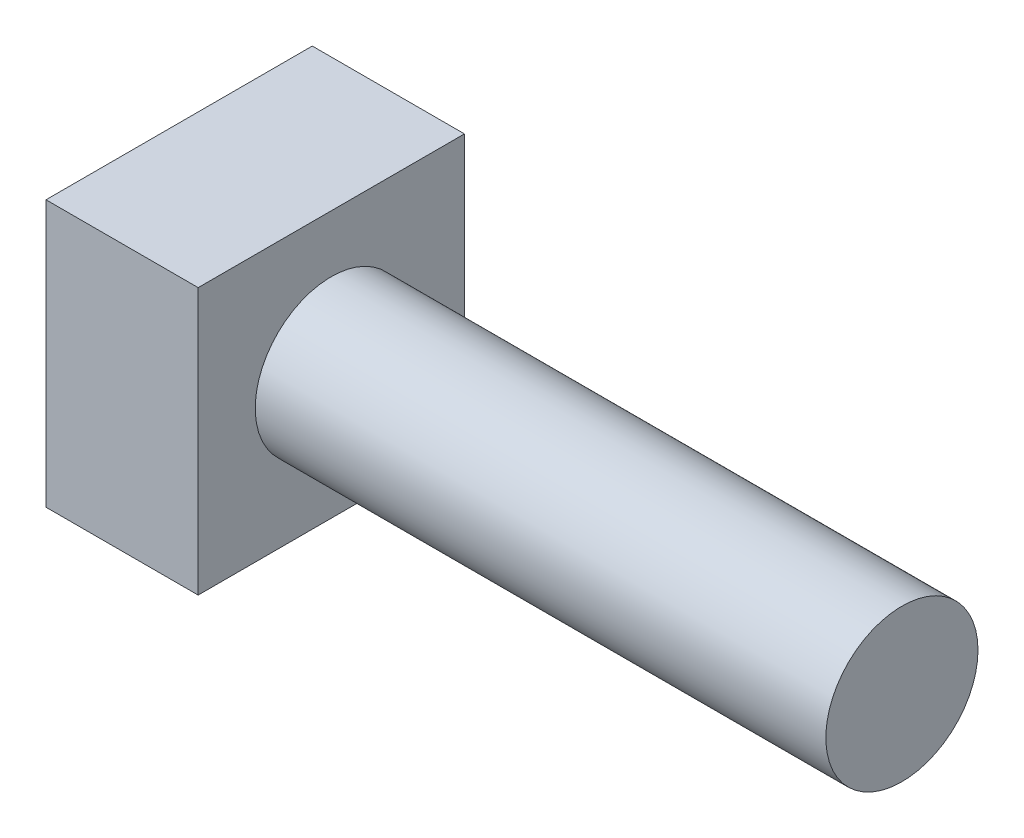
ISO-10303-21;
HEADER;
FILE_DESCRIPTION(('STEP AP214'),'2;1');
FILE_NAME('part.step','',(''),(''),'','','');
FILE_SCHEMA(('AUTOMOTIVE_DESIGN { 1 0 10303 214 1 1 1 1 }'));
ENDSEC;
DATA;
#1=APPLICATION_CONTEXT('core data for automotive mechanical design processes');
#2=APPLICATION_PROTOCOL_DEFINITION('international standard','automotive_design',2000,#1);
#3=PRODUCT_CONTEXT('',#1,'mechanical');
#4=PRODUCT('Part','Part','',(#3));
#5=PRODUCT_RELATED_PRODUCT_CATEGORY('part','',(#4));
#6=PRODUCT_DEFINITION_FORMATION('','',#4);
#7=PRODUCT_DEFINITION_CONTEXT('part definition',#1,'design');
#8=PRODUCT_DEFINITION('design','',#6,#7);
#9=PRODUCT_DEFINITION_SHAPE('','',#8);
#10=(LENGTH_UNIT() NAMED_UNIT(*) SI_UNIT(.MILLI.,.METRE.));
#11=(NAMED_UNIT(*) PLANE_ANGLE_UNIT() SI_UNIT($,.RADIAN.));
#12=(NAMED_UNIT(*) SI_UNIT($,.STERADIAN.) SOLID_ANGLE_UNIT());
#13=UNCERTAINTY_MEASURE_WITH_UNIT(LENGTH_MEASURE(1.E-05),#10,'distance_accuracy_value','');
#14=(GEOMETRIC_REPRESENTATION_CONTEXT(3) GLOBAL_UNCERTAINTY_ASSIGNED_CONTEXT((#13)) GLOBAL_UNIT_ASSIGNED_CONTEXT((#10,
#11,#12)) REPRESENTATION_CONTEXT('',''));
#15=CARTESIAN_POINT('',(0.,0.,0.));
#16=DIRECTION('',(0.,0.,1.));
#17=DIRECTION('',(1.,0.,0.));
#18=AXIS2_PLACEMENT_3D('',#15,#16,#17);
#19=CARTESIAN_POINT('',(4.,3.5,-3.5));
#20=DIRECTION('',(0.,0.,1.));
#21=DIRECTION('',(0.,-1.,0.));
#22=AXIS2_PLACEMENT_3D('',#19,#20,#21);
#23=PLANE('',#22);
#24=DIRECTION('',(0.,1.,0.));
#25=VECTOR('',#24,1.);
#26=CARTESIAN_POINT('',(0.,3.5,-3.5));
#27=LINE('',#26,#25);
#28=CARTESIAN_POINT('',(0.,-3.5,-3.5));
#29=VERTEX_POINT('',#28);
#30=CARTESIAN_POINT('',(0.,3.5,-3.5));
#31=VERTEX_POINT('',#30);
#32=EDGE_CURVE('E99',#29,#31,#27,.T.);
#33=ORIENTED_EDGE('',*,*,#32,.T.);
#34=DIRECTION('',(-1.,0.,0.));
#35=VECTOR('',#34,1.);
#36=CARTESIAN_POINT('',(4.,3.5,-3.5));
#37=LINE('',#36,#35);
#38=CARTESIAN_POINT('',(4.,3.5,-3.5));
#39=VERTEX_POINT('',#38);
#40=EDGE_CURVE('E36',#39,#31,#37,.T.);
#41=ORIENTED_EDGE('',*,*,#40,.F.);
#42=DIRECTION('',(0.,1.,0.));
#43=VECTOR('',#42,1.);
#44=CARTESIAN_POINT('',(4.,3.5,-3.5));
#45=LINE('',#44,#43);
#46=CARTESIAN_POINT('',(4.,-3.5,-3.5));
#47=VERTEX_POINT('',#46);
#48=EDGE_CURVE('E86',#47,#39,#45,.T.);
#49=ORIENTED_EDGE('',*,*,#48,.F.);
#50=DIRECTION('',(-1.,0.,0.));
#51=VECTOR('',#50,1.);
#52=CARTESIAN_POINT('',(4.,-3.5,-3.5));
#53=LINE('',#52,#51);
#54=EDGE_CURVE('E95',#47,#29,#53,.T.);
#55=ORIENTED_EDGE('',*,*,#54,.T.);
#56=EDGE_LOOP('',(#33,#41,#49,#55));
#57=FACE_BOUND('',#56,.T.);
#58=ADVANCED_FACE('F33',(#57),#23,.F.);
#59=CARTESIAN_POINT('',(4.,3.5,3.5));
#60=DIRECTION('',(0.,-1.,0.));
#61=DIRECTION('',(0.,0.,-1.));
#62=AXIS2_PLACEMENT_3D('',#59,#60,#61);
#63=PLANE('',#62);
#64=DIRECTION('',(0.,0.,1.));
#65=VECTOR('',#64,1.);
#66=CARTESIAN_POINT('',(0.,3.5,3.5));
#67=LINE('',#66,#65);
#68=CARTESIAN_POINT('',(0.,3.5,3.5));
#69=VERTEX_POINT('',#68);
#70=EDGE_CURVE('E91',#31,#69,#67,.T.);
#71=ORIENTED_EDGE('',*,*,#70,.T.);
#72=DIRECTION('',(-1.,0.,0.));
#73=VECTOR('',#72,1.);
#74=CARTESIAN_POINT('',(4.,3.5,3.5));
#75=LINE('',#74,#73);
#76=CARTESIAN_POINT('',(4.,3.5,3.5));
#77=VERTEX_POINT('',#76);
#78=EDGE_CURVE('E89',#77,#69,#75,.T.);
#79=ORIENTED_EDGE('',*,*,#78,.F.);
#80=DIRECTION('',(0.,0.,1.));
#81=VECTOR('',#80,1.);
#82=CARTESIAN_POINT('',(4.,3.5,3.5));
#83=LINE('',#82,#81);
#84=EDGE_CURVE('E81',#39,#77,#83,.T.);
#85=ORIENTED_EDGE('',*,*,#84,.F.);
#86=ORIENTED_EDGE('',*,*,#40,.T.);
#87=EDGE_LOOP('',(#71,#79,#85,#86));
#88=FACE_BOUND('',#87,.T.);
#89=ADVANCED_FACE('F90',(#88),#63,.F.);
#90=CARTESIAN_POINT('',(4.,3.5,3.5));
#91=DIRECTION('',(0.,0.,-1.));
#92=DIRECTION('',(0.,1.,0.));
#93=AXIS2_PLACEMENT_3D('',#90,#91,#92);
#94=PLANE('',#93);
#95=DIRECTION('',(0.,-1.,0.));
#96=VECTOR('',#95,1.);
#97=CARTESIAN_POINT('',(0.,3.5,3.5));
#98=LINE('',#97,#96);
#99=CARTESIAN_POINT('',(0.,-3.5,3.5));
#100=VERTEX_POINT('',#99);
#101=EDGE_CURVE('E67',#69,#100,#98,.T.);
#102=ORIENTED_EDGE('',*,*,#101,.T.);
#103=DIRECTION('',(-1.,0.,0.));
#104=VECTOR('',#103,1.);
#105=CARTESIAN_POINT('',(4.,-3.5,3.5));
#106=LINE('',#105,#104);
#107=CARTESIAN_POINT('',(4.,-3.5,3.5));
#108=VERTEX_POINT('',#107);
#109=EDGE_CURVE('E92',#108,#100,#106,.T.);
#110=ORIENTED_EDGE('',*,*,#109,.F.);
#111=DIRECTION('',(0.,-1.,0.));
#112=VECTOR('',#111,1.);
#113=CARTESIAN_POINT('',(4.,3.5,3.5));
#114=LINE('',#113,#112);
#115=EDGE_CURVE('E84',#77,#108,#114,.T.);
#116=ORIENTED_EDGE('',*,*,#115,.F.);
#117=ORIENTED_EDGE('',*,*,#78,.T.);
#118=EDGE_LOOP('',(#102,#110,#116,#117));
#119=FACE_BOUND('',#118,.T.);
#120=ADVANCED_FACE('F93',(#119),#94,.F.);
#121=CARTESIAN_POINT('',(4.,-3.5,3.5));
#122=DIRECTION('',(0.,1.,0.));
#123=DIRECTION('',(0.,0.,1.));
#124=AXIS2_PLACEMENT_3D('',#121,#122,#123);
#125=PLANE('',#124);
#126=DIRECTION('',(0.,0.,-1.));
#127=VECTOR('',#126,1.);
#128=CARTESIAN_POINT('',(0.,-3.5,3.5));
#129=LINE('',#128,#127);
#130=EDGE_CURVE('E73',#100,#29,#129,.T.);
#131=ORIENTED_EDGE('',*,*,#130,.T.);
#132=ORIENTED_EDGE('',*,*,#54,.F.);
#133=DIRECTION('',(0.,0.,-1.));
#134=VECTOR('',#133,1.);
#135=CARTESIAN_POINT('',(4.,-3.5,3.5));
#136=LINE('',#135,#134);
#137=EDGE_CURVE('E50',#108,#47,#136,.T.);
#138=ORIENTED_EDGE('',*,*,#137,.F.);
#139=ORIENTED_EDGE('',*,*,#109,.T.);
#140=EDGE_LOOP('',(#131,#132,#138,#139));
#141=FACE_BOUND('',#140,.T.);
#142=ADVANCED_FACE('F107',(#141),#125,.F.);
#143=CARTESIAN_POINT('',(4.,0.,0.));
#144=DIRECTION('',(1.,0.,0.));
#145=DIRECTION('',(0.,0.,-1.));
#146=AXIS2_PLACEMENT_3D('',#143,#144,#145);
#147=PLANE('',#146);
#148=CARTESIAN_POINT('',(4.,0.,0.));
#149=DIRECTION('',(1.,0.,0.));
#150=DIRECTION('',(0.,0.,-1.));
#151=AXIS2_PLACEMENT_3D('',#148,#149,#150);
#152=CIRCLE('',#151,2.);
#153=CARTESIAN_POINT('',(4.,0.,-2.));
#154=VERTEX_POINT('',#153);
#155=EDGE_CURVE('E11',#154,#154,#152,.T.);
#156=ORIENTED_EDGE('',*,*,#155,.F.);
#157=EDGE_LOOP('',(#156));
#158=FACE_BOUND('',#157,.T.);
#159=ORIENTED_EDGE('',*,*,#48,.T.);
#160=ORIENTED_EDGE('',*,*,#84,.T.);
#161=ORIENTED_EDGE('',*,*,#115,.T.);
#162=ORIENTED_EDGE('',*,*,#137,.T.);
#163=EDGE_LOOP('',(#159,#160,#161,#162));
#164=FACE_BOUND('',#163,.T.);
#165=ADVANCED_FACE('F82',(#158,#164),#147,.T.);
#166=CARTESIAN_POINT('',(0.,0.,0.));
#167=DIRECTION('',(1.,0.,0.));
#168=DIRECTION('',(0.,0.,-1.));
#169=AXIS2_PLACEMENT_3D('',#166,#167,#168);
#170=PLANE('',#169);
#171=ORIENTED_EDGE('',*,*,#32,.F.);
#172=ORIENTED_EDGE('',*,*,#130,.F.);
#173=ORIENTED_EDGE('',*,*,#101,.F.);
#174=ORIENTED_EDGE('',*,*,#70,.F.);
#175=EDGE_LOOP('',(#171,#172,#173,#174));
#176=FACE_BOUND('',#175,.T.);
#177=ADVANCED_FACE('F110',(#176),#170,.F.);
#178=CARTESIAN_POINT('',(19.,0.,0.));
#179=DIRECTION('',(-1.,0.,0.));
#180=DIRECTION('',(0.,0.,1.));
#181=AXIS2_PLACEMENT_3D('',#178,#179,#180);
#182=CYLINDRICAL_SURFACE('',#181,2.);
#183=CARTESIAN_POINT('',(19.,0.,0.));
#184=DIRECTION('',(1.,0.,0.));
#185=DIRECTION('',(0.,0.,-1.));
#186=AXIS2_PLACEMENT_3D('',#183,#184,#185);
#187=CIRCLE('',#186,2.);
#188=CARTESIAN_POINT('',(19.,0.,-2.));
#189=VERTEX_POINT('',#188);
#190=EDGE_CURVE('E102',#189,#189,#187,.T.);
#191=ORIENTED_EDGE('',*,*,#190,.F.);
#192=EDGE_LOOP('',(#191));
#193=FACE_BOUND('',#192,.T.);
#194=ORIENTED_EDGE('',*,*,#155,.T.);
#195=EDGE_LOOP('',(#194));
#196=FACE_BOUND('',#195,.T.);
#197=ADVANCED_FACE('F118',(#193,#196),#182,.T.);
#198=CARTESIAN_POINT('',(19.,0.,0.));
#199=DIRECTION('',(1.,0.,0.));
#200=DIRECTION('',(0.,0.,-1.));
#201=AXIS2_PLACEMENT_3D('',#198,#199,#200);
#202=PLANE('',#201);
#203=ORIENTED_EDGE('',*,*,#190,.T.);
#204=EDGE_LOOP('',(#203));
#205=FACE_BOUND('',#204,.T.);
#206=ADVANCED_FACE('F116',(#205),#202,.T.);
#207=CLOSED_SHELL('',(#58,#89,#120,#142,#165,#177,#197,#206));
#208=MANIFOLD_SOLID_BREP('B2',#207);
#209=ADVANCED_BREP_SHAPE_REPRESENTATION('',(#18,#208),#14);
#210=SHAPE_DEFINITION_REPRESENTATION(#9,#209);
ENDSEC;
END-ISO-10303-21;
